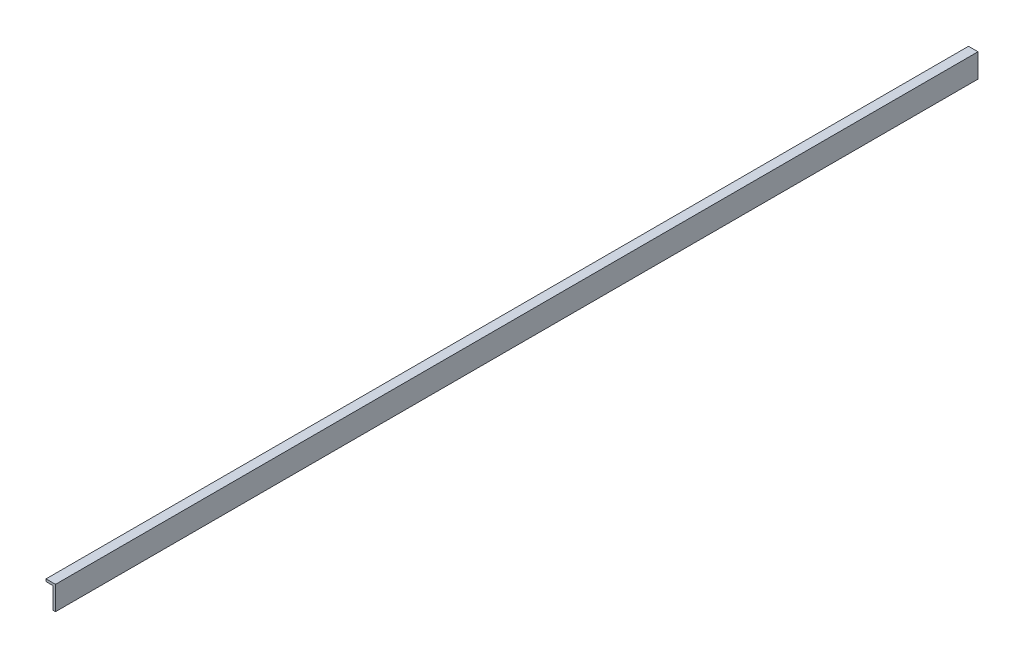
ISO-10303-21;
HEADER;
FILE_DESCRIPTION(('STEP AP214'),'2;1');
FILE_NAME('part.step','',(''),(''),'','','');
FILE_SCHEMA(('AUTOMOTIVE_DESIGN { 1 0 10303 214 1 1 1 1 }'));
ENDSEC;
DATA;
#1=APPLICATION_CONTEXT('core data for automotive mechanical design processes');
#2=APPLICATION_PROTOCOL_DEFINITION('international standard','automotive_design',2000,#1);
#3=PRODUCT_CONTEXT('',#1,'mechanical');
#4=PRODUCT('Part','Part','',(#3));
#5=PRODUCT_RELATED_PRODUCT_CATEGORY('part','',(#4));
#6=PRODUCT_DEFINITION_FORMATION('','',#4);
#7=PRODUCT_DEFINITION_CONTEXT('part definition',#1,'design');
#8=PRODUCT_DEFINITION('design','',#6,#7);
#9=PRODUCT_DEFINITION_SHAPE('','',#8);
#10=(LENGTH_UNIT() NAMED_UNIT(*) SI_UNIT(.MILLI.,.METRE.));
#11=(NAMED_UNIT(*) PLANE_ANGLE_UNIT() SI_UNIT($,.RADIAN.));
#12=(NAMED_UNIT(*) SI_UNIT($,.STERADIAN.) SOLID_ANGLE_UNIT());
#13=UNCERTAINTY_MEASURE_WITH_UNIT(LENGTH_MEASURE(1.E-05),#10,'distance_accuracy_value','');
#14=(GEOMETRIC_REPRESENTATION_CONTEXT(3) GLOBAL_UNCERTAINTY_ASSIGNED_CONTEXT((#13)) GLOBAL_UNIT_ASSIGNED_CONTEXT((#10,
#11,#12)) REPRESENTATION_CONTEXT('',''));
#15=CARTESIAN_POINT('',(0.,0.,0.));
#16=DIRECTION('',(0.,0.,1.));
#17=DIRECTION('',(1.,0.,0.));
#18=AXIS2_PLACEMENT_3D('',#15,#16,#17);
#19=CARTESIAN_POINT('',(54.,18.,-797.5));
#20=DIRECTION('',(-1.,0.,0.));
#21=DIRECTION('',(0.,0.,1.));
#22=AXIS2_PLACEMENT_3D('',#19,#20,#21);
#23=PLANE('',#22);
#24=DIRECTION('',(0.,-1.,0.));
#25=VECTOR('',#24,1.);
#26=CARTESIAN_POINT('',(54.,18.,-20.));
#27=LINE('',#26,#25);
#28=CARTESIAN_POINT('',(54.,18.,-20.));
#29=VERTEX_POINT('',#28);
#30=CARTESIAN_POINT('',(54.,0.,-20.));
#31=VERTEX_POINT('',#30);
#32=EDGE_CURVE('E124',#29,#31,#27,.T.);
#33=ORIENTED_EDGE('',*,*,#32,.F.);
#34=DIRECTION('',(0.,0.,1.));
#35=VECTOR('',#34,1.);
#36=CARTESIAN_POINT('',(54.,18.,-797.5));
#37=LINE('',#36,#35);
#38=CARTESIAN_POINT('',(54.,18.,-797.5));
#39=VERTEX_POINT('',#38);
#40=EDGE_CURVE('E11',#39,#29,#37,.T.);
#41=ORIENTED_EDGE('',*,*,#40,.F.);
#42=DIRECTION('',(0.,-1.,0.));
#43=VECTOR('',#42,1.);
#44=CARTESIAN_POINT('',(54.,18.,-797.5));
#45=LINE('',#44,#43);
#46=CARTESIAN_POINT('',(54.,0.,-797.5));
#47=VERTEX_POINT('',#46);
#48=EDGE_CURVE('E138',#39,#47,#45,.T.);
#49=ORIENTED_EDGE('',*,*,#48,.T.);
#50=DIRECTION('',(0.,0.,1.));
#51=VECTOR('',#50,1.);
#52=CARTESIAN_POINT('',(54.,0.,-797.5));
#53=LINE('',#52,#51);
#54=EDGE_CURVE('E42',#47,#31,#53,.T.);
#55=ORIENTED_EDGE('',*,*,#54,.T.);
#56=EDGE_LOOP('',(#33,#41,#49,#55));
#57=FACE_BOUND('',#56,.T.);
#58=ADVANCED_FACE('F39',(#57),#23,.T.);
#59=CARTESIAN_POINT('',(48.,18.,-797.5));
#60=DIRECTION('',(0.,-1.,0.));
#61=DIRECTION('',(0.,0.,-1.));
#62=AXIS2_PLACEMENT_3D('',#59,#60,#61);
#63=PLANE('',#62);
#64=DIRECTION('',(1.,0.,0.));
#65=VECTOR('',#64,1.);
#66=CARTESIAN_POINT('',(48.,18.,-20.));
#67=LINE('',#66,#65);
#68=CARTESIAN_POINT('',(48.,18.,-20.));
#69=VERTEX_POINT('',#68);
#70=EDGE_CURVE('E136',#69,#29,#67,.T.);
#71=ORIENTED_EDGE('',*,*,#70,.F.);
#72=DIRECTION('',(0.,0.,1.));
#73=VECTOR('',#72,1.);
#74=CARTESIAN_POINT('',(48.,18.,-797.5));
#75=LINE('',#74,#73);
#76=CARTESIAN_POINT('',(48.,18.,-797.5));
#77=VERTEX_POINT('',#76);
#78=EDGE_CURVE('E48',#77,#69,#75,.T.);
#79=ORIENTED_EDGE('',*,*,#78,.F.);
#80=DIRECTION('',(1.,0.,0.));
#81=VECTOR('',#80,1.);
#82=CARTESIAN_POINT('',(48.,18.,-797.5));
#83=LINE('',#82,#81);
#84=EDGE_CURVE('E114',#77,#39,#83,.T.);
#85=ORIENTED_EDGE('',*,*,#84,.T.);
#86=ORIENTED_EDGE('',*,*,#40,.T.);
#87=EDGE_LOOP('',(#71,#79,#85,#86));
#88=FACE_BOUND('',#87,.T.);
#89=ADVANCED_FACE('F146',(#88),#63,.T.);
#90=CARTESIAN_POINT('',(48.,20.,-797.5));
#91=DIRECTION('',(-1.,0.,0.));
#92=DIRECTION('',(0.,0.,1.));
#93=AXIS2_PLACEMENT_3D('',#90,#91,#92);
#94=PLANE('',#93);
#95=DIRECTION('',(0.,-1.,0.));
#96=VECTOR('',#95,1.);
#97=CARTESIAN_POINT('',(48.,20.,-20.));
#98=LINE('',#97,#96);
#99=CARTESIAN_POINT('',(48.,20.,-20.));
#100=VERTEX_POINT('',#99);
#101=EDGE_CURVE('E101',#100,#69,#98,.T.);
#102=ORIENTED_EDGE('',*,*,#101,.F.);
#103=DIRECTION('',(0.,0.,1.));
#104=VECTOR('',#103,1.);
#105=CARTESIAN_POINT('',(48.,20.,-797.5));
#106=LINE('',#105,#104);
#107=CARTESIAN_POINT('',(48.,20.,-797.5));
#108=VERTEX_POINT('',#107);
#109=EDGE_CURVE('E96',#108,#100,#106,.T.);
#110=ORIENTED_EDGE('',*,*,#109,.F.);
#111=DIRECTION('',(0.,-1.,0.));
#112=VECTOR('',#111,1.);
#113=CARTESIAN_POINT('',(48.,20.,-797.5));
#114=LINE('',#113,#112);
#115=EDGE_CURVE('E99',#108,#77,#114,.T.);
#116=ORIENTED_EDGE('',*,*,#115,.T.);
#117=ORIENTED_EDGE('',*,*,#78,.T.);
#118=EDGE_LOOP('',(#102,#110,#116,#117));
#119=FACE_BOUND('',#118,.T.);
#120=ADVANCED_FACE('F98',(#119),#94,.T.);
#121=CARTESIAN_POINT('',(56.,20.,-797.5));
#122=DIRECTION('',(0.,1.,0.));
#123=DIRECTION('',(0.,0.,1.));
#124=AXIS2_PLACEMENT_3D('',#121,#122,#123);
#125=PLANE('',#124);
#126=DIRECTION('',(-1.,0.,0.));
#127=VECTOR('',#126,1.);
#128=CARTESIAN_POINT('',(56.,20.,-20.));
#129=LINE('',#128,#127);
#130=CARTESIAN_POINT('',(56.,20.,-20.));
#131=VERTEX_POINT('',#130);
#132=EDGE_CURVE('E133',#131,#100,#129,.T.);
#133=ORIENTED_EDGE('',*,*,#132,.F.);
#134=DIRECTION('',(0.,0.,1.));
#135=VECTOR('',#134,1.);
#136=CARTESIAN_POINT('',(56.,20.,-797.5));
#137=LINE('',#136,#135);
#138=CARTESIAN_POINT('',(56.,20.,-797.5));
#139=VERTEX_POINT('',#138);
#140=EDGE_CURVE('E106',#139,#131,#137,.T.);
#141=ORIENTED_EDGE('',*,*,#140,.F.);
#142=DIRECTION('',(-1.,0.,0.));
#143=VECTOR('',#142,1.);
#144=CARTESIAN_POINT('',(56.,20.,-797.5));
#145=LINE('',#144,#143);
#146=EDGE_CURVE('E112',#139,#108,#145,.T.);
#147=ORIENTED_EDGE('',*,*,#146,.T.);
#148=ORIENTED_EDGE('',*,*,#109,.T.);
#149=EDGE_LOOP('',(#133,#141,#147,#148));
#150=FACE_BOUND('',#149,.T.);
#151=ADVANCED_FACE('F116',(#150),#125,.T.);
#152=CARTESIAN_POINT('',(56.,0.,-797.5));
#153=DIRECTION('',(1.,0.,0.));
#154=DIRECTION('',(0.,0.,-1.));
#155=AXIS2_PLACEMENT_3D('',#152,#153,#154);
#156=PLANE('',#155);
#157=DIRECTION('',(0.,1.,0.));
#158=VECTOR('',#157,1.);
#159=CARTESIAN_POINT('',(56.,0.,-20.));
#160=LINE('',#159,#158);
#161=CARTESIAN_POINT('',(56.,0.,-20.));
#162=VERTEX_POINT('',#161);
#163=EDGE_CURVE('E130',#162,#131,#160,.T.);
#164=ORIENTED_EDGE('',*,*,#163,.F.);
#165=DIRECTION('',(0.,0.,1.));
#166=VECTOR('',#165,1.);
#167=CARTESIAN_POINT('',(56.,0.,-797.5));
#168=LINE('',#167,#166);
#169=CARTESIAN_POINT('',(56.,0.,-797.5));
#170=VERTEX_POINT('',#169);
#171=EDGE_CURVE('E141',#170,#162,#168,.T.);
#172=ORIENTED_EDGE('',*,*,#171,.F.);
#173=DIRECTION('',(0.,1.,0.));
#174=VECTOR('',#173,1.);
#175=CARTESIAN_POINT('',(56.,0.,-797.5));
#176=LINE('',#175,#174);
#177=EDGE_CURVE('E117',#170,#139,#176,.T.);
#178=ORIENTED_EDGE('',*,*,#177,.T.);
#179=ORIENTED_EDGE('',*,*,#140,.T.);
#180=EDGE_LOOP('',(#164,#172,#178,#179));
#181=FACE_BOUND('',#180,.T.);
#182=ADVANCED_FACE('F159',(#181),#156,.T.);
#183=CARTESIAN_POINT('',(54.,0.,-797.5));
#184=DIRECTION('',(0.,-1.,0.));
#185=DIRECTION('',(0.,0.,-1.));
#186=AXIS2_PLACEMENT_3D('',#183,#184,#185);
#187=PLANE('',#186);
#188=DIRECTION('',(1.,0.,0.));
#189=VECTOR('',#188,1.);
#190=CARTESIAN_POINT('',(54.,0.,-20.));
#191=LINE('',#190,#189);
#192=EDGE_CURVE('E127',#31,#162,#191,.T.);
#193=ORIENTED_EDGE('',*,*,#192,.F.);
#194=ORIENTED_EDGE('',*,*,#54,.F.);
#195=DIRECTION('',(1.,0.,0.));
#196=VECTOR('',#195,1.);
#197=CARTESIAN_POINT('',(54.,0.,-797.5));
#198=LINE('',#197,#196);
#199=EDGE_CURVE('E119',#47,#170,#198,.T.);
#200=ORIENTED_EDGE('',*,*,#199,.T.);
#201=ORIENTED_EDGE('',*,*,#171,.T.);
#202=EDGE_LOOP('',(#193,#194,#200,#201));
#203=FACE_BOUND('',#202,.T.);
#204=ADVANCED_FACE('F143',(#203),#187,.T.);
#205=CARTESIAN_POINT('',(0.,0.,-797.5));
#206=DIRECTION('',(0.,0.,1.));
#207=DIRECTION('',(1.,0.,0.));
#208=AXIS2_PLACEMENT_3D('',#205,#206,#207);
#209=PLANE('',#208);
#210=ORIENTED_EDGE('',*,*,#48,.F.);
#211=ORIENTED_EDGE('',*,*,#84,.F.);
#212=ORIENTED_EDGE('',*,*,#115,.F.);
#213=ORIENTED_EDGE('',*,*,#146,.F.);
#214=ORIENTED_EDGE('',*,*,#177,.F.);
#215=ORIENTED_EDGE('',*,*,#199,.F.);
#216=EDGE_LOOP('',(#210,#211,#212,#213,#214,#215));
#217=FACE_BOUND('',#216,.T.);
#218=ADVANCED_FACE('F110',(#217),#209,.F.);
#219=CARTESIAN_POINT('',(0.,0.,-20.));
#220=DIRECTION('',(0.,0.,1.));
#221=DIRECTION('',(1.,0.,0.));
#222=AXIS2_PLACEMENT_3D('',#219,#220,#221);
#223=PLANE('',#222);
#224=ORIENTED_EDGE('',*,*,#32,.T.);
#225=ORIENTED_EDGE('',*,*,#192,.T.);
#226=ORIENTED_EDGE('',*,*,#163,.T.);
#227=ORIENTED_EDGE('',*,*,#132,.T.);
#228=ORIENTED_EDGE('',*,*,#101,.T.);
#229=ORIENTED_EDGE('',*,*,#70,.T.);
#230=EDGE_LOOP('',(#224,#225,#226,#227,#228,#229));
#231=FACE_BOUND('',#230,.T.);
#232=ADVANCED_FACE('F145',(#231),#223,.T.);
#233=CLOSED_SHELL('',(#58,#89,#120,#151,#182,#204,#218,#232));
#234=MANIFOLD_SOLID_BREP('B2',#233);
#235=ADVANCED_BREP_SHAPE_REPRESENTATION('',(#18,#234),#14);
#236=SHAPE_DEFINITION_REPRESENTATION(#9,#235);
ENDSEC;
END-ISO-10303-21;
